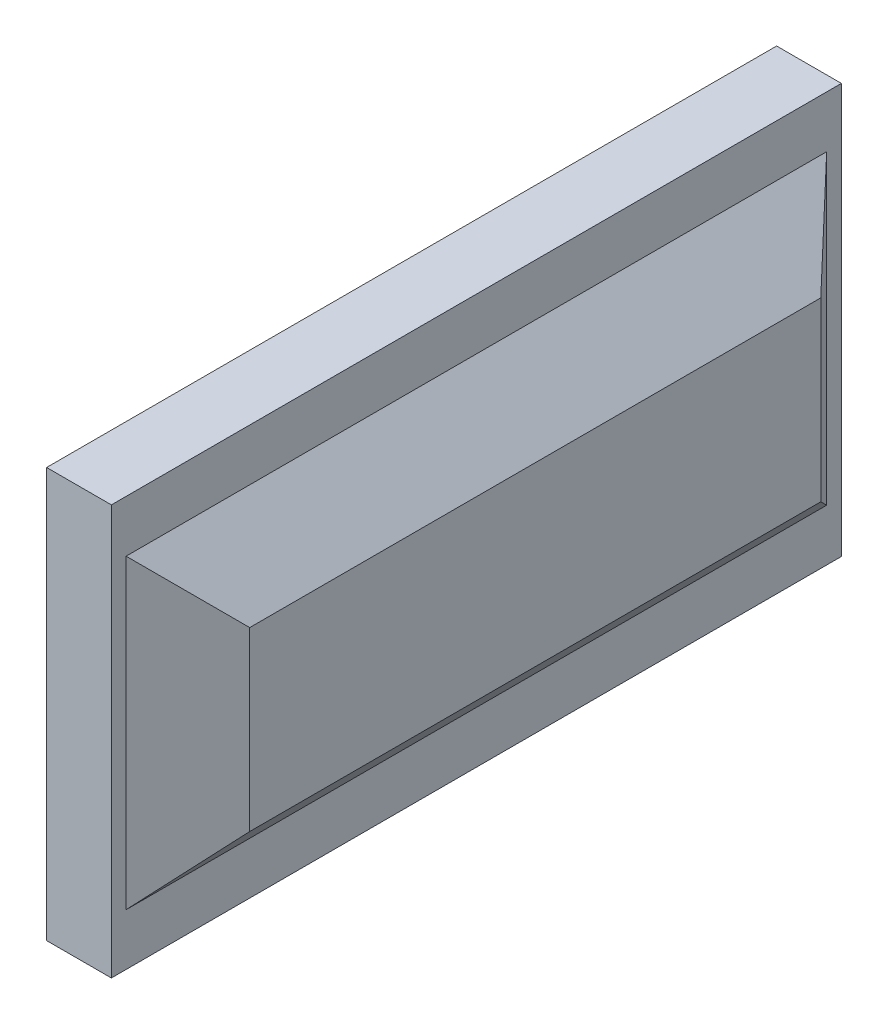
ISO-10303-21;
HEADER;
FILE_DESCRIPTION(('STEP AP214'),'2;1');
FILE_NAME('part.step','',(''),(''),'','','');
FILE_SCHEMA(('AUTOMOTIVE_DESIGN { 1 0 10303 214 1 1 1 1 }'));
ENDSEC;
DATA;
#1=APPLICATION_CONTEXT('core data for automotive mechanical design processes');
#2=APPLICATION_PROTOCOL_DEFINITION('international standard','automotive_design',2000,#1);
#3=PRODUCT_CONTEXT('',#1,'mechanical');
#4=PRODUCT('Part','Part','',(#3));
#5=PRODUCT_RELATED_PRODUCT_CATEGORY('part','',(#4));
#6=PRODUCT_DEFINITION_FORMATION('','',#4);
#7=PRODUCT_DEFINITION_CONTEXT('part definition',#1,'design');
#8=PRODUCT_DEFINITION('design','',#6,#7);
#9=PRODUCT_DEFINITION_SHAPE('','',#8);
#10=(LENGTH_UNIT() NAMED_UNIT(*) SI_UNIT(.MILLI.,.METRE.));
#11=(NAMED_UNIT(*) PLANE_ANGLE_UNIT() SI_UNIT($,.RADIAN.));
#12=(NAMED_UNIT(*) SI_UNIT($,.STERADIAN.) SOLID_ANGLE_UNIT());
#13=UNCERTAINTY_MEASURE_WITH_UNIT(LENGTH_MEASURE(1.E-05),#10,'distance_accuracy_value','');
#14=(GEOMETRIC_REPRESENTATION_CONTEXT(3) GLOBAL_UNCERTAINTY_ASSIGNED_CONTEXT((#13)) GLOBAL_UNIT_ASSIGNED_CONTEXT((#10,
#11,#12)) REPRESENTATION_CONTEXT('',''));
#15=CARTESIAN_POINT('',(0.,0.,0.));
#16=DIRECTION('',(0.,0.,1.));
#17=DIRECTION('',(1.,0.,0.));
#18=AXIS2_PLACEMENT_3D('',#15,#16,#17);
#19=CARTESIAN_POINT('',(1598.99999242226,1280.,280.));
#20=DIRECTION('',(1.,0.,0.));
#21=DIRECTION('',(0.,-1.,0.));
#22=AXIS2_PLACEMENT_3D('',#19,#20,#21);
#23=PLANE('',#22);
#24=DIRECTION('',(0.,1.,0.));
#25=VECTOR('',#24,1.);
#26=CARTESIAN_POINT('',(1598.99999242226,1280.,280.));
#27=LINE('',#26,#25);
#28=CARTESIAN_POINT('',(1598.99999242226,1280.,280.));
#29=VERTEX_POINT('',#28);
#30=CARTESIAN_POINT('',(1598.99999242226,1976.,280.));
#31=VERTEX_POINT('',#30);
#32=EDGE_CURVE('E129',#29,#31,#27,.T.);
#33=ORIENTED_EDGE('',*,*,#32,.F.);
#34=DIRECTION('',(0.,0.,1.));
#35=VECTOR('',#34,1.);
#36=CARTESIAN_POINT('',(1598.99999242226,1280.,-960.));
#37=LINE('',#36,#35);
#38=CARTESIAN_POINT('',(1598.99999242226,1280.,-960.));
#39=VERTEX_POINT('',#38);
#40=EDGE_CURVE('E138',#39,#29,#37,.T.);
#41=ORIENTED_EDGE('',*,*,#40,.F.);
#42=DIRECTION('',(0.,-1.,0.));
#43=VECTOR('',#42,1.);
#44=CARTESIAN_POINT('',(1598.99999242226,1976.,-960.));
#45=LINE('',#44,#43);
#46=CARTESIAN_POINT('',(1598.99999242226,1976.,-960.));
#47=VERTEX_POINT('',#46);
#48=EDGE_CURVE('E135',#47,#39,#45,.T.);
#49=ORIENTED_EDGE('',*,*,#48,.F.);
#50=DIRECTION('',(0.,0.,-1.));
#51=VECTOR('',#50,1.);
#52=CARTESIAN_POINT('',(1598.99999242226,1976.,280.));
#53=LINE('',#52,#51);
#54=EDGE_CURVE('E132',#31,#47,#53,.T.);
#55=ORIENTED_EDGE('',*,*,#54,.F.);
#56=EDGE_LOOP('',(#33,#41,#49,#55));
#57=FACE_BOUND('',#56,.T.);
#58=DIRECTION('',(0.,0.,-1.));
#59=VECTOR('',#58,1.);
#60=CARTESIAN_POINT('',(1598.99999242226,1368.,255.));
#61=LINE('',#60,#59);
#62=CARTESIAN_POINT('',(1598.99999242226,1368.,255.));
#63=VERTEX_POINT('',#62);
#64=CARTESIAN_POINT('',(1598.99999242226,1368.,-935.));
#65=VERTEX_POINT('',#64);
#66=EDGE_CURVE('E84',#63,#65,#61,.T.);
#67=ORIENTED_EDGE('',*,*,#66,.F.);
#68=DIRECTION('',(0.,-1.,0.));
#69=VECTOR('',#68,1.);
#70=CARTESIAN_POINT('',(1598.99999242226,1888.,255.));
#71=LINE('',#70,#69);
#72=CARTESIAN_POINT('',(1598.99999242226,1888.,255.));
#73=VERTEX_POINT('',#72);
#74=EDGE_CURVE('E32',#73,#63,#71,.T.);
#75=ORIENTED_EDGE('',*,*,#74,.F.);
#76=DIRECTION('',(0.,0.,1.));
#77=VECTOR('',#76,1.);
#78=CARTESIAN_POINT('',(1598.99999242226,1888.,-935.));
#79=LINE('',#78,#77);
#80=CARTESIAN_POINT('',(1598.99999242226,1888.,-935.));
#81=VERTEX_POINT('',#80);
#82=EDGE_CURVE('E102',#81,#73,#79,.T.);
#83=ORIENTED_EDGE('',*,*,#82,.F.);
#84=DIRECTION('',(0.,1.,0.));
#85=VECTOR('',#84,1.);
#86=CARTESIAN_POINT('',(1598.99999242226,1368.,-935.));
#87=LINE('',#86,#85);
#88=EDGE_CURVE('E96',#65,#81,#87,.T.);
#89=ORIENTED_EDGE('',*,*,#88,.F.);
#90=EDGE_LOOP('',(#67,#75,#83,#89));
#91=FACE_BOUND('',#90,.T.);
#92=ADVANCED_FACE('F17',(#57,#91),#23,.T.);
#93=CARTESIAN_POINT('',(1598.99999242226,1280.,280.));
#94=DIRECTION('',(0.,0.,1.));
#95=DIRECTION('',(0.,-1.,0.));
#96=AXIS2_PLACEMENT_3D('',#93,#94,#95);
#97=PLANE('',#96);
#98=DIRECTION('',(0.,1.,0.));
#99=VECTOR('',#98,1.);
#100=CARTESIAN_POINT('',(1488.99999242226,1280.,280.));
#101=LINE('',#100,#99);
#102=CARTESIAN_POINT('',(1488.99999242226,1280.,280.));
#103=VERTEX_POINT('',#102);
#104=CARTESIAN_POINT('',(1488.99999242226,1976.,280.));
#105=VERTEX_POINT('',#104);
#106=EDGE_CURVE('E119',#103,#105,#101,.T.);
#107=ORIENTED_EDGE('',*,*,#106,.F.);
#108=DIRECTION('',(-1.,0.,0.));
#109=VECTOR('',#108,1.);
#110=CARTESIAN_POINT('',(1598.99999242226,1280.,280.));
#111=LINE('',#110,#109);
#112=EDGE_CURVE('E40',#29,#103,#111,.T.);
#113=ORIENTED_EDGE('',*,*,#112,.F.);
#114=ORIENTED_EDGE('',*,*,#32,.T.);
#115=DIRECTION('',(-1.,0.,0.));
#116=VECTOR('',#115,1.);
#117=CARTESIAN_POINT('',(1598.99999242226,1976.,280.));
#118=LINE('',#117,#116);
#119=EDGE_CURVE('E11',#31,#105,#118,.T.);
#120=ORIENTED_EDGE('',*,*,#119,.T.);
#121=EDGE_LOOP('',(#107,#113,#114,#120));
#122=FACE_BOUND('',#121,.T.);
#123=ADVANCED_FACE('F19',(#122),#97,.T.);
#124=CARTESIAN_POINT('',(1598.99999242226,1976.,280.));
#125=DIRECTION('',(0.,1.,0.));
#126=DIRECTION('',(0.,0.,1.));
#127=AXIS2_PLACEMENT_3D('',#124,#125,#126);
#128=PLANE('',#127);
#129=DIRECTION('',(0.,0.,-1.));
#130=VECTOR('',#129,1.);
#131=CARTESIAN_POINT('',(1488.99999242226,1976.,280.));
#132=LINE('',#131,#130);
#133=CARTESIAN_POINT('',(1488.99999242226,1976.,-960.));
#134=VERTEX_POINT('',#133);
#135=EDGE_CURVE('E120',#105,#134,#132,.T.);
#136=ORIENTED_EDGE('',*,*,#135,.F.);
#137=ORIENTED_EDGE('',*,*,#119,.F.);
#138=ORIENTED_EDGE('',*,*,#54,.T.);
#139=DIRECTION('',(-1.,0.,0.));
#140=VECTOR('',#139,1.);
#141=CARTESIAN_POINT('',(1598.99999242226,1976.,-960.));
#142=LINE('',#141,#140);
#143=EDGE_CURVE('E25',#47,#134,#142,.T.);
#144=ORIENTED_EDGE('',*,*,#143,.T.);
#145=EDGE_LOOP('',(#136,#137,#138,#144));
#146=FACE_BOUND('',#145,.T.);
#147=ADVANCED_FACE('F146',(#146),#128,.T.);
#148=CARTESIAN_POINT('',(1598.99999242226,1976.,-960.));
#149=DIRECTION('',(0.,0.,-1.));
#150=DIRECTION('',(0.,1.,0.));
#151=AXIS2_PLACEMENT_3D('',#148,#149,#150);
#152=PLANE('',#151);
#153=DIRECTION('',(0.,-1.,0.));
#154=VECTOR('',#153,1.);
#155=CARTESIAN_POINT('',(1488.99999242226,1976.,-960.));
#156=LINE('',#155,#154);
#157=CARTESIAN_POINT('',(1488.99999242226,1280.,-960.));
#158=VERTEX_POINT('',#157);
#159=EDGE_CURVE('E123',#134,#158,#156,.T.);
#160=ORIENTED_EDGE('',*,*,#159,.F.);
#161=ORIENTED_EDGE('',*,*,#143,.F.);
#162=ORIENTED_EDGE('',*,*,#48,.T.);
#163=DIRECTION('',(-1.,0.,0.));
#164=VECTOR('',#163,1.);
#165=CARTESIAN_POINT('',(1598.99999242226,1280.,-960.));
#166=LINE('',#165,#164);
#167=EDGE_CURVE('E142',#39,#158,#166,.T.);
#168=ORIENTED_EDGE('',*,*,#167,.T.);
#169=EDGE_LOOP('',(#160,#161,#162,#168));
#170=FACE_BOUND('',#169,.T.);
#171=ADVANCED_FACE('F150',(#170),#152,.T.);
#172=CARTESIAN_POINT('',(1598.99999242226,1280.,-960.));
#173=DIRECTION('',(0.,-1.,0.));
#174=DIRECTION('',(0.,0.,-1.));
#175=AXIS2_PLACEMENT_3D('',#172,#173,#174);
#176=PLANE('',#175);
#177=DIRECTION('',(0.,0.,1.));
#178=VECTOR('',#177,1.);
#179=CARTESIAN_POINT('',(1488.99999242226,1280.,-960.));
#180=LINE('',#179,#178);
#181=EDGE_CURVE('E126',#158,#103,#180,.T.);
#182=ORIENTED_EDGE('',*,*,#181,.F.);
#183=ORIENTED_EDGE('',*,*,#167,.F.);
#184=ORIENTED_EDGE('',*,*,#40,.T.);
#185=ORIENTED_EDGE('',*,*,#112,.T.);
#186=EDGE_LOOP('',(#182,#183,#184,#185));
#187=FACE_BOUND('',#186,.T.);
#188=ADVANCED_FACE('F158',(#187),#176,.T.);
#189=CARTESIAN_POINT('',(1488.99999242226,1280.,280.));
#190=DIRECTION('',(1.,0.,0.));
#191=DIRECTION('',(0.,-1.,0.));
#192=AXIS2_PLACEMENT_3D('',#189,#190,#191);
#193=PLANE('',#192);
#194=ORIENTED_EDGE('',*,*,#106,.T.);
#195=ORIENTED_EDGE('',*,*,#135,.T.);
#196=ORIENTED_EDGE('',*,*,#159,.T.);
#197=ORIENTED_EDGE('',*,*,#181,.T.);
#198=EDGE_LOOP('',(#194,#195,#196,#197));
#199=FACE_BOUND('',#198,.T.);
#200=ADVANCED_FACE('F153',(#199),#193,.F.);
#201=CARTESIAN_POINT('',(1698.99999242226,1478.,145.));
#202=DIRECTION('',(1.,0.,0.));
#203=DIRECTION('',(0.,0.,-1.));
#204=AXIS2_PLACEMENT_3D('',#201,#202,#203);
#205=PLANE('',#204);
#206=DIRECTION('',(0.,1.,0.));
#207=VECTOR('',#206,1.);
#208=CARTESIAN_POINT('',(1698.99999242226,1478.,145.));
#209=LINE('',#208,#207);
#210=CARTESIAN_POINT('',(1698.99999242226,1478.,145.));
#211=VERTEX_POINT('',#210);
#212=CARTESIAN_POINT('',(1698.99999242226,1778.,145.));
#213=VERTEX_POINT('',#212);
#214=EDGE_CURVE('E116',#211,#213,#209,.T.);
#215=ORIENTED_EDGE('',*,*,#214,.F.);
#216=DIRECTION('',(0.,0.,1.));
#217=VECTOR('',#216,1.);
#218=CARTESIAN_POINT('',(1698.99999242226,1478.,-825.));
#219=LINE('',#218,#217);
#220=CARTESIAN_POINT('',(1698.99999242226,1478.,-825.));
#221=VERTEX_POINT('',#220);
#222=EDGE_CURVE('E92',#221,#211,#219,.T.);
#223=ORIENTED_EDGE('',*,*,#222,.F.);
#224=DIRECTION('',(0.,-1.,0.));
#225=VECTOR('',#224,1.);
#226=CARTESIAN_POINT('',(1698.99999242226,1778.,-825.));
#227=LINE('',#226,#225);
#228=CARTESIAN_POINT('',(1698.99999242226,1778.,-825.));
#229=VERTEX_POINT('',#228);
#230=EDGE_CURVE('E99',#229,#221,#227,.T.);
#231=ORIENTED_EDGE('',*,*,#230,.F.);
#232=DIRECTION('',(0.,0.,-1.));
#233=VECTOR('',#232,1.);
#234=CARTESIAN_POINT('',(1698.99999242226,1778.,145.));
#235=LINE('',#234,#233);
#236=EDGE_CURVE('E112',#213,#229,#235,.T.);
#237=ORIENTED_EDGE('',*,*,#236,.F.);
#238=EDGE_LOOP('',(#215,#223,#231,#237));
#239=FACE_BOUND('',#238,.T.);
#240=ADVANCED_FACE('F166',(#239),#205,.T.);
#241=CARTESIAN_POINT('',(1835.3636287859,1628.,-5.0000000000005));
#242=DIRECTION('',(-0.739940073395944,0.,-0.672672793996313));
#243=DIRECTION('',(-0.672672793996313,0.,0.739940073395944));
#244=AXIS2_PLACEMENT_3D('',#241,#242,#243);
#245=PLANE('',#244);
#246=DIRECTION('',(-0.540738070435875,0.594811877479463,0.594811877479462));
#247=VECTOR('',#246,1.);
#248=CARTESIAN_POINT('',(1698.99999242226,1778.,145.));
#249=LINE('',#248,#247);
#250=EDGE_CURVE('E110',#213,#73,#249,.T.);
#251=ORIENTED_EDGE('',*,*,#250,.T.);
#252=ORIENTED_EDGE('',*,*,#74,.T.);
#253=DIRECTION('',(-0.540738070435875,-0.594811877479463,0.594811877479462));
#254=VECTOR('',#253,1.);
#255=CARTESIAN_POINT('',(1698.99999242226,1478.,145.));
#256=LINE('',#255,#254);
#257=EDGE_CURVE('E89',#211,#63,#256,.T.);
#258=ORIENTED_EDGE('',*,*,#257,.F.);
#259=ORIENTED_EDGE('',*,*,#214,.T.);
#260=EDGE_LOOP('',(#251,#252,#258,#259));
#261=FACE_BOUND('',#260,.T.);
#262=ADVANCED_FACE('F177',(#261),#245,.F.);
#263=CARTESIAN_POINT('',(2139.90908333135,1293.,-340.));
#264=DIRECTION('',(-0.739940073395944,-0.672672793996312,0.));
#265=DIRECTION('',(0.672672793996312,-0.739940073395944,0.));
#266=AXIS2_PLACEMENT_3D('',#263,#264,#265);
#267=PLANE('',#266);
#268=DIRECTION('',(0.540738070435875,-0.594811877479463,0.594811877479462));
#269=VECTOR('',#268,1.);
#270=CARTESIAN_POINT('',(1598.99999242226,1888.,-935.));
#271=LINE('',#270,#269);
#272=EDGE_CURVE('E103',#81,#229,#271,.T.);
#273=ORIENTED_EDGE('',*,*,#272,.F.);
#274=ORIENTED_EDGE('',*,*,#82,.T.);
#275=ORIENTED_EDGE('',*,*,#250,.F.);
#276=ORIENTED_EDGE('',*,*,#236,.T.);
#277=EDGE_LOOP('',(#273,#274,#275,#276));
#278=FACE_BOUND('',#277,.T.);
#279=ADVANCED_FACE('F181',(#278),#267,.F.);
#280=CARTESIAN_POINT('',(1835.3636287859,1628.,-675.));
#281=DIRECTION('',(-0.739940073395943,0.,0.672672793996313));
#282=DIRECTION('',(0.672672793996313,0.,0.739940073395943));
#283=AXIS2_PLACEMENT_3D('',#280,#281,#282);
#284=PLANE('',#283);
#285=DIRECTION('',(0.540738070435876,0.594811877479463,0.594811877479462));
#286=VECTOR('',#285,1.);
#287=CARTESIAN_POINT('',(1598.99999242226,1368.,-935.));
#288=LINE('',#287,#286);
#289=EDGE_CURVE('E87',#65,#221,#288,.T.);
#290=ORIENTED_EDGE('',*,*,#289,.F.);
#291=ORIENTED_EDGE('',*,*,#88,.T.);
#292=ORIENTED_EDGE('',*,*,#272,.T.);
#293=ORIENTED_EDGE('',*,*,#230,.T.);
#294=EDGE_LOOP('',(#290,#291,#292,#293));
#295=FACE_BOUND('',#294,.T.);
#296=ADVANCED_FACE('F95',(#295),#284,.F.);
#297=CARTESIAN_POINT('',(2139.90908333135,1963.,-340.));
#298=DIRECTION('',(-0.739940073395944,0.672672793996312,0.));
#299=DIRECTION('',(-0.672672793996313,-0.739940073395944,0.));
#300=AXIS2_PLACEMENT_3D('',#297,#298,#299);
#301=PLANE('',#300);
#302=ORIENTED_EDGE('',*,*,#257,.T.);
#303=ORIENTED_EDGE('',*,*,#66,.T.);
#304=ORIENTED_EDGE('',*,*,#289,.T.);
#305=ORIENTED_EDGE('',*,*,#222,.T.);
#306=EDGE_LOOP('',(#302,#303,#304,#305));
#307=FACE_BOUND('',#306,.T.);
#308=ADVANCED_FACE('F86',(#307),#301,.F.);
#309=CLOSED_SHELL('',(#92,#123,#147,#171,#188,#200,#240,#262,#279,#296,#308));
#310=MANIFOLD_SOLID_BREP('B1',#309);
#311=ADVANCED_BREP_SHAPE_REPRESENTATION('',(#18,#310),#14);
#312=SHAPE_DEFINITION_REPRESENTATION(#9,#311);
ENDSEC;
END-ISO-10303-21;
